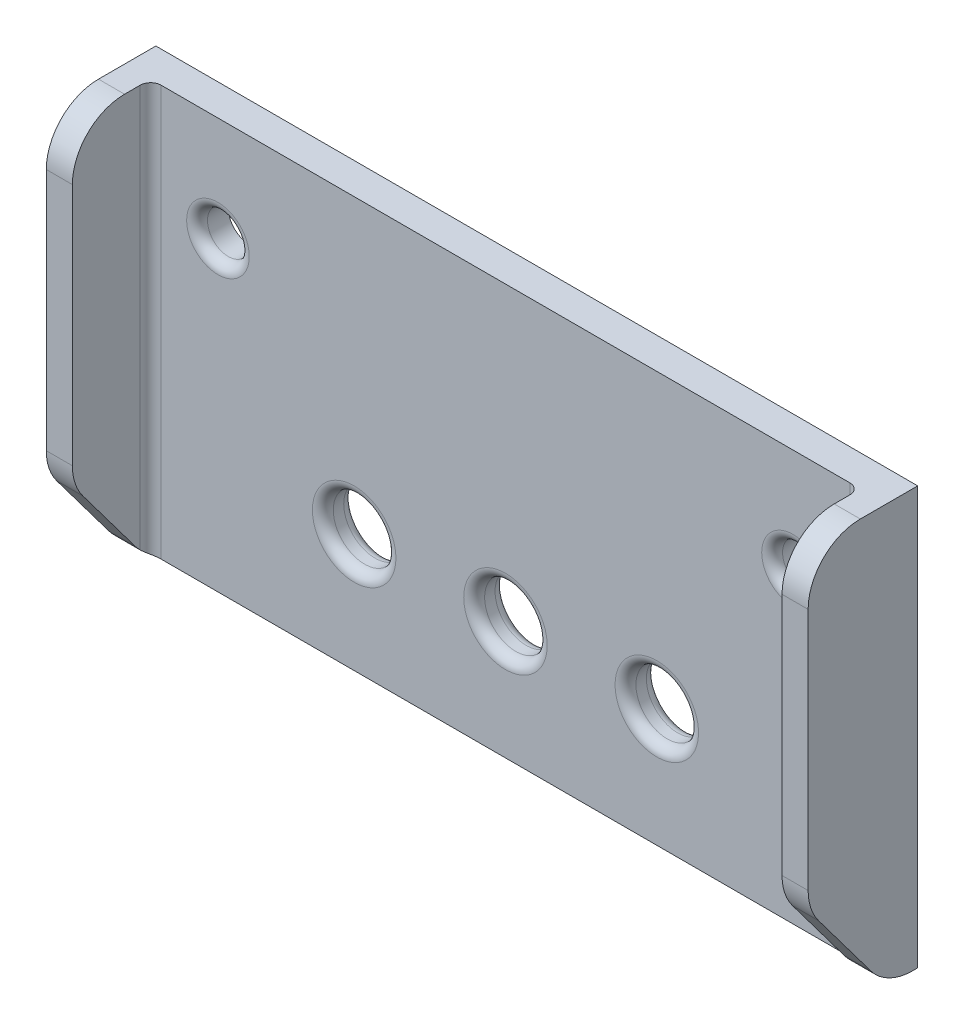
ISO-10303-21;
HEADER;
FILE_DESCRIPTION(('STEP AP214'),'2;1');
FILE_NAME('part.step','',(''),(''),'','','');
FILE_SCHEMA(('AUTOMOTIVE_DESIGN { 1 0 10303 214 1 1 1 1 }'));
ENDSEC;
DATA;
#1=APPLICATION_CONTEXT('core data for automotive mechanical design processes');
#2=APPLICATION_PROTOCOL_DEFINITION('international standard','automotive_design',2000,#1);
#3=PRODUCT_CONTEXT('',#1,'mechanical');
#4=PRODUCT('Part','Part','',(#3));
#5=PRODUCT_RELATED_PRODUCT_CATEGORY('part','',(#4));
#6=PRODUCT_DEFINITION_FORMATION('','',#4);
#7=PRODUCT_DEFINITION_CONTEXT('part definition',#1,'design');
#8=PRODUCT_DEFINITION('design','',#6,#7);
#9=PRODUCT_DEFINITION_SHAPE('','',#8);
#10=(LENGTH_UNIT() NAMED_UNIT(*) SI_UNIT(.MILLI.,.METRE.));
#11=(NAMED_UNIT(*) PLANE_ANGLE_UNIT() SI_UNIT($,.RADIAN.));
#12=(NAMED_UNIT(*) SI_UNIT($,.STERADIAN.) SOLID_ANGLE_UNIT());
#13=UNCERTAINTY_MEASURE_WITH_UNIT(LENGTH_MEASURE(1.E-05),#10,'distance_accuracy_value','');
#14=(GEOMETRIC_REPRESENTATION_CONTEXT(3) GLOBAL_UNCERTAINTY_ASSIGNED_CONTEXT((#13)) GLOBAL_UNIT_ASSIGNED_CONTEXT((#10,
#11,#12)) REPRESENTATION_CONTEXT('',''));
#15=CARTESIAN_POINT('',(0.,0.,0.));
#16=DIRECTION('',(0.,0.,1.));
#17=DIRECTION('',(1.,0.,0.));
#18=AXIS2_PLACEMENT_3D('',#15,#16,#17);
#19=CARTESIAN_POINT('',(79.9999999999999,-24.,0.499999999999987));
#20=DIRECTION('',(-1.,0.,0.));
#21=DIRECTION('',(0.,0.,1.));
#22=AXIS2_PLACEMENT_3D('',#19,#20,#21);
#23=CYLINDRICAL_SURFACE('',#22,5.);
#24=DIRECTION('',(1.,0.,0.));
#25=VECTOR('',#24,1.);
#26=CARTESIAN_POINT('',(79.9999999999999,-27.,4.49999999999999));
#27=LINE('',#26,#25);
#28=CARTESIAN_POINT('',(23.9999999999999,-27.,4.49999999999999));
#29=VERTEX_POINT('',#28);
#30=CARTESIAN_POINT('',(26.4999999999999,-27.,4.49999999999999));
#31=VERTEX_POINT('',#30);
#32=EDGE_CURVE('E180',#29,#31,#27,.T.);
#33=ORIENTED_EDGE('',*,*,#32,.F.);
#34=CARTESIAN_POINT('',(23.9999999999999,-24.,0.499999999999994));
#35=DIRECTION('',(1.,0.,0.));
#36=DIRECTION('',(0.,1.,0.));
#37=AXIS2_PLACEMENT_3D('',#34,#35,#36);
#38=CIRCLE('',#37,5.);
#39=CARTESIAN_POINT('',(23.9999999999999,-27.5707142142714,4.));
#40=VERTEX_POINT('',#39);
#41=EDGE_CURVE('E239',#40,#29,#38,.F.);
#42=ORIENTED_EDGE('',*,*,#41,.F.);
#43=CARTESIAN_POINT('',(23.9999999999999,-27.5707142142714,4.));
#44=CARTESIAN_POINT('',(23.9999930676676,-27.6002186072207,3.9699006570499));
#45=CARTESIAN_POINT('',(23.9986395311535,-27.6293320134944,3.93943493010971));
#46=CARTESIAN_POINT('',(23.9929994413152,-27.6866936609947,3.87787893576926));
#47=CARTESIAN_POINT('',(23.9887082699565,-27.7149404667493,3.84678775995062));
#48=CARTESIAN_POINT('',(23.971001342381,-27.7984571182347,3.75250029079684));
#49=CARTESIAN_POINT('',(23.9527461770954,-27.8521381486544,3.68866295917825));
#50=CARTESIAN_POINT('',(23.9073130950106,-27.9421972995765,3.57621109710281));
#51=CARTESIAN_POINT('',(23.883031082257,-27.979765118423,3.52737514429793));
#52=CARTESIAN_POINT('',(23.8250499209178,-28.0503857885509,3.43221179524257));
#53=CARTESIAN_POINT('',(23.7913751461828,-28.0834500003449,3.38587827185391));
#54=CARTESIAN_POINT('',(23.7140395694052,-28.1445644660207,3.29741112008585));
#55=CARTESIAN_POINT('',(23.6702843804115,-28.17256255451,3.25532296804957));
#56=CARTESIAN_POINT('',(23.5735716970965,-28.2222728300454,3.17852823174094));
#57=CARTESIAN_POINT('',(23.5206165144656,-28.2439865925143,3.14381979802089));
#58=CARTESIAN_POINT('',(23.4155387941315,-28.2777449090995,3.08878145465239));
#59=CARTESIAN_POINT('',(23.3644310835303,-28.2907400373399,3.06708993429551));
#60=CARTESIAN_POINT('',(23.2583768128417,-28.3113331748112,3.03235478286105));
#61=CARTESIAN_POINT('',(23.2034382432818,-28.3189420695415,3.01929371334593));
#62=CARTESIAN_POINT('',(23.1232414566439,-28.3258974870813,3.00731429327415));
#63=CARTESIAN_POINT('',(23.0986826545608,-28.3274839828488,3.00457346971455));
#64=CARTESIAN_POINT('',(23.0494208900586,-28.3295973862361,3.00091773228209));
#65=CARTESIAN_POINT('',(23.0247181949247,-28.3301258592244,3.00000012094068));
#66=CARTESIAN_POINT('',(22.9999999999999,-28.3301270189222,3.));
#67=B_SPLINE_CURVE_WITH_KNOTS('',3,(#43,#44,#45,#46,#47,#48,#49,#50,#51,#52,#53,#54,#55,#56,#57,
#58,#59,#60,#61,#62,#63,#64,#65,#66),.UNSPECIFIED.,.F.,.F.,(4,2,2,2,2,2,2,2,2,2,2,4),(0.,
0.126387089943436,0.252973321143465,0.507695609755686,0.705639917777366,0.903075271793413,
1.10244036970792,1.30175544524449,1.47186716731677,1.64163410690023,1.7158453186886,
1.78994665192581),.UNSPECIFIED.);
#68=CARTESIAN_POINT('',(22.9999999999999,-28.3301270189222,3.00000000000001));
#69=VERTEX_POINT('',#68);
#70=EDGE_CURVE('E310',#40,#69,#67,.T.);
#71=ORIENTED_EDGE('',*,*,#70,.T.);
#72=DIRECTION('',(-1.,0.,0.));
#73=VECTOR('',#72,1.);
#74=CARTESIAN_POINT('',(79.9999999999999,-28.3301270189222,3.));
#75=LINE('',#74,#73);
#76=CARTESIAN_POINT('',(-43.0000000000001,-28.3301270189222,3.00000000000002));
#77=VERTEX_POINT('',#76);
#78=EDGE_CURVE('E235',#77,#69,#75,.F.);
#79=ORIENTED_EDGE('',*,*,#78,.F.);
#80=CARTESIAN_POINT('',(-43.0000000000001,-28.3301270189222,3.));
#81=CARTESIAN_POINT('',(-43.0250917043528,-28.3301264619005,2.99999863256401));
#82=CARTESIAN_POINT('',(-43.0501706936837,-28.3295814792149,3.0009451434556));
#83=CARTESIAN_POINT('',(-43.1001347422109,-28.3274046434899,3.00471078494186));
#84=CARTESIAN_POINT('',(-43.1250198428232,-28.325773029381,3.00752950387154));
#85=CARTESIAN_POINT('',(-43.1989388654176,-28.3192692738345,3.01872819076792));
#86=CARTESIAN_POINT('',(-43.2474518438432,-28.3127881439752,3.02985113206557));
#87=CARTESIAN_POINT('',(-43.3415742856007,-28.2956426343319,3.05885396236154));
#88=CARTESIAN_POINT('',(-43.3871846974332,-28.2849796293442,3.07673163066474));
#89=CARTESIAN_POINT('',(-43.4744441900434,-28.2596525601428,3.11838730385573));
#90=CARTESIAN_POINT('',(-43.5160910644644,-28.2449862848217,3.14216856879013));
#91=CARTESIAN_POINT('',(-43.5959155786588,-28.2113492295649,3.19547047522606));
#92=CARTESIAN_POINT('',(-43.633923704345,-28.192247268289,3.22516098444924));
#93=CARTESIAN_POINT('',(-43.7042168298947,-28.1504259428718,3.28844071428515));
#94=CARTESIAN_POINT('',(-43.7365028778026,-28.1277072426152,3.32202921907991));
#95=CARTESIAN_POINT('',(-43.7985121611949,-28.0762876833706,3.3958803553395));
#96=CARTESIAN_POINT('',(-43.8275251346771,-28.0472002313887,3.43646746790958));
#97=CARTESIAN_POINT('',(-43.8784102176725,-27.9855577173115,3.51960504306239));
#98=CARTESIAN_POINT('',(-43.9002628219138,-27.9529934986219,3.56216051402092));
#99=CARTESIAN_POINT('',(-43.932986664365,-27.892690996402,3.63827355021968));
#100=CARTESIAN_POINT('',(-43.9452221375383,-27.8655130198292,3.67170377403303));
#101=CARTESIAN_POINT('',(-43.9658545944003,-27.809673280999,3.73856262045828));
#102=CARTESIAN_POINT('',(-43.9742478770305,-27.7810101175632,3.77199121064137));
#103=CARTESIAN_POINT('',(-43.9874103338676,-27.7226196562202,3.83826901931417));
#104=CARTESIAN_POINT('',(-43.992199926385,-27.6928993683897,3.8711204560123));
#105=CARTESIAN_POINT('',(-43.9984899148028,-27.632494632088,3.93612588078439));
#106=CARTESIAN_POINT('',(-43.9999970022617,-27.6018122746964,3.96828115520262));
#107=CARTESIAN_POINT('',(-44.0000000000001,-27.5707142142714,4.));
#108=B_SPLINE_CURVE_WITH_KNOTS('',3,(#80,#81,#82,#83,#84,#85,#86,#87,#88,#89,#90,#91,#92,#93,
#94,#95,#96,#97,#98,#99,#100,#101,#102,#103,#104,#105,#106,#107),.UNSPECIFIED.,.F.,.F.,(4,2,2,2,
2,2,2,2,2,2,2,2,2,4),(0.,0.0752264083476392,0.150436281229343,0.300218677401701,
0.449951873655379,0.599767939272063,0.754758687632558,0.909721018790721,1.08232580800139,
1.25539694790243,1.38956975374294,1.52387153336175,1.65740651426769,1.79066902133077),.UNSPECIFIED.);
#109=CARTESIAN_POINT('',(-44.0000000000001,-27.5707142142714,4.));
#110=VERTEX_POINT('',#109);
#111=EDGE_CURVE('E61',#77,#110,#108,.T.);
#112=ORIENTED_EDGE('',*,*,#111,.T.);
#113=CARTESIAN_POINT('',(-44.0000000000001,-24.,0.500000000000003));
#114=DIRECTION('',(-1.,0.,0.));
#115=DIRECTION('',(0.,-1.,0.));
#116=AXIS2_PLACEMENT_3D('',#113,#114,#115);
#117=CIRCLE('',#116,5.);
#118=CARTESIAN_POINT('',(-44.0000000000001,-27.,4.5));
#119=VERTEX_POINT('',#118);
#120=EDGE_CURVE('E232',#119,#110,#117,.F.);
#121=ORIENTED_EDGE('',*,*,#120,.F.);
#122=DIRECTION('',(-1.,0.,0.));
#123=VECTOR('',#122,1.);
#124=CARTESIAN_POINT('',(79.9999999999999,-27.,4.49999999999999));
#125=LINE('',#124,#123);
#126=CARTESIAN_POINT('',(-46.5000000000001,-27.,4.5));
#127=VERTEX_POINT('',#126);
#128=EDGE_CURVE('E228',#127,#119,#125,.F.);
#129=ORIENTED_EDGE('',*,*,#128,.F.);
#130=CARTESIAN_POINT('',(-46.5000000000001,-24.,0.500000000000003));
#131=DIRECTION('',(1.,0.,0.));
#132=DIRECTION('',(0.,1.,0.));
#133=AXIS2_PLACEMENT_3D('',#130,#131,#132);
#134=CIRCLE('',#133,5.);
#135=CARTESIAN_POINT('',(-46.5000000000001,-29.,0.500000000000003));
#136=VERTEX_POINT('',#135);
#137=EDGE_CURVE('E225',#136,#127,#134,.F.);
#138=ORIENTED_EDGE('',*,*,#137,.F.);
#139=DIRECTION('',(1.,0.,0.));
#140=VECTOR('',#139,1.);
#141=CARTESIAN_POINT('',(79.9999999999999,-29.,0.499999999999987));
#142=LINE('',#141,#140);
#143=CARTESIAN_POINT('',(26.4999999999999,-29.,0.499999999999994));
#144=VERTEX_POINT('',#143);
#145=EDGE_CURVE('E175',#144,#136,#142,.F.);
#146=ORIENTED_EDGE('',*,*,#145,.F.);
#147=CARTESIAN_POINT('',(26.4999999999999,-24.,0.499999999999994));
#148=DIRECTION('',(-1.,0.,0.));
#149=DIRECTION('',(0.,-1.,0.));
#150=AXIS2_PLACEMENT_3D('',#147,#148,#149);
#151=CIRCLE('',#150,5.);
#152=EDGE_CURVE('E242',#31,#144,#151,.F.);
#153=ORIENTED_EDGE('',*,*,#152,.F.);
#154=EDGE_LOOP('',(#33,#42,#71,#79,#112,#121,#129,#138,#146,#153));
#155=FACE_BOUND('',#154,.T.);
#156=ADVANCED_FACE('F45',(#155),#23,.T.);
#157=CARTESIAN_POINT('',(-46.5000000000001,11.,3.));
#158=DIRECTION('',(1.,0.,0.));
#159=DIRECTION('',(0.,1.,0.));
#160=AXIS2_PLACEMENT_3D('',#157,#158,#159);
#161=PLANE('',#160);
#162=DIRECTION('',(0.,-1.,0.));
#163=VECTOR('',#162,1.);
#164=CARTESIAN_POINT('',(-46.5000000000001,11.,10.5));
#165=LINE('',#164,#163);
#166=CARTESIAN_POINT('',(-46.5000000000001,5.99999999999999,10.5));
#167=VERTEX_POINT('',#166);
#168=CARTESIAN_POINT('',(-46.5000000000001,-17.3333333333333,10.5));
#169=VERTEX_POINT('',#168);
#170=EDGE_CURVE('E649',#167,#169,#165,.T.);
#171=ORIENTED_EDGE('',*,*,#170,.F.);
#172=CARTESIAN_POINT('',(-46.5000000000001,5.99999999999999,5.5));
#173=DIRECTION('',(1.,0.,0.));
#174=DIRECTION('',(0.,1.,0.));
#175=AXIS2_PLACEMENT_3D('',#172,#173,#174);
#176=CIRCLE('',#175,5.);
#177=CARTESIAN_POINT('',(-46.5000000000001,11.,5.5));
#178=VERTEX_POINT('',#177);
#179=EDGE_CURVE('E256',#167,#178,#176,.F.);
#180=ORIENTED_EDGE('',*,*,#179,.T.);
#181=DIRECTION('',(0.,0.,-1.));
#182=VECTOR('',#181,1.);
#183=CARTESIAN_POINT('',(-46.5000000000001,11.,3.));
#184=LINE('',#183,#182);
#185=CARTESIAN_POINT('',(-46.5000000000001,11.,0.));
#186=VERTEX_POINT('',#185);
#187=EDGE_CURVE('E195',#178,#186,#184,.T.);
#188=ORIENTED_EDGE('',*,*,#187,.T.);
#189=DIRECTION('',(0.,-1.,0.));
#190=VECTOR('',#189,1.);
#191=CARTESIAN_POINT('',(-46.5000000000001,11.,0.));
#192=LINE('',#191,#190);
#193=CARTESIAN_POINT('',(-46.5000000000001,-29.,0.));
#194=VERTEX_POINT('',#193);
#195=EDGE_CURVE('E187',#186,#194,#192,.T.);
#196=ORIENTED_EDGE('',*,*,#195,.T.);
#197=DIRECTION('',(0.,0.,-1.));
#198=VECTOR('',#197,1.);
#199=CARTESIAN_POINT('',(-46.5000000000001,-29.,3.));
#200=LINE('',#199,#198);
#201=EDGE_CURVE('E168',#136,#194,#200,.T.);
#202=ORIENTED_EDGE('',*,*,#201,.F.);
#203=ORIENTED_EDGE('',*,*,#137,.T.);
#204=DIRECTION('',(0.,-0.8,-0.6));
#205=VECTOR('',#204,1.);
#206=CARTESIAN_POINT('',(-46.5000000000001,-3.40000000000001,22.2));
#207=LINE('',#206,#205);
#208=CARTESIAN_POINT('',(-46.5000000000001,-20.3333333333333,9.5));
#209=VERTEX_POINT('',#208);
#210=EDGE_CURVE('E635',#209,#127,#207,.T.);
#211=ORIENTED_EDGE('',*,*,#210,.F.);
#212=CARTESIAN_POINT('',(-46.5000000000001,-17.3333333333333,5.5));
#213=DIRECTION('',(1.,0.,0.));
#214=DIRECTION('',(0.,1.,0.));
#215=AXIS2_PLACEMENT_3D('',#212,#213,#214);
#216=CIRCLE('',#215,5.);
#217=EDGE_CURVE('E253',#209,#169,#216,.F.);
#218=ORIENTED_EDGE('',*,*,#217,.T.);
#219=EDGE_LOOP('',(#171,#180,#188,#196,#202,#203,#211,#218));
#220=FACE_BOUND('',#219,.T.);
#221=ADVANCED_FACE('F193',(#220),#161,.F.);
#222=CARTESIAN_POINT('',(26.4999999999999,-29.,3.));
#223=DIRECTION('',(0.,1.,0.));
#224=DIRECTION('',(0.,0.,1.));
#225=AXIS2_PLACEMENT_3D('',#222,#223,#224);
#226=PLANE('',#225);
#227=DIRECTION('',(0.,0.,-1.));
#228=VECTOR('',#227,1.);
#229=CARTESIAN_POINT('',(26.4999999999999,-29.,3.));
#230=LINE('',#229,#228);
#231=CARTESIAN_POINT('',(26.4999999999999,-29.,0.));
#232=VERTEX_POINT('',#231);
#233=EDGE_CURVE('E181',#144,#232,#230,.T.);
#234=ORIENTED_EDGE('',*,*,#233,.F.);
#235=ORIENTED_EDGE('',*,*,#145,.T.);
#236=ORIENTED_EDGE('',*,*,#201,.T.);
#237=DIRECTION('',(1.,0.,0.));
#238=VECTOR('',#237,1.);
#239=CARTESIAN_POINT('',(26.4999999999999,-29.,0.));
#240=LINE('',#239,#238);
#241=EDGE_CURVE('E172',#194,#232,#240,.T.);
#242=ORIENTED_EDGE('',*,*,#241,.T.);
#243=EDGE_LOOP('',(#234,#235,#236,#242));
#244=FACE_BOUND('',#243,.T.);
#245=ADVANCED_FACE('F171',(#244),#226,.F.);
#246=CARTESIAN_POINT('',(26.4999999999999,11.,3.));
#247=DIRECTION('',(-1.,0.,0.));
#248=DIRECTION('',(0.,-1.,0.));
#249=AXIS2_PLACEMENT_3D('',#246,#247,#248);
#250=PLANE('',#249);
#251=DIRECTION('',(0.,0.,-1.));
#252=VECTOR('',#251,1.);
#253=CARTESIAN_POINT('',(26.4999999999999,11.,3.));
#254=LINE('',#253,#252);
#255=CARTESIAN_POINT('',(26.4999999999999,11.,5.5));
#256=VERTEX_POINT('',#255);
#257=CARTESIAN_POINT('',(26.4999999999999,11.,0.));
#258=VERTEX_POINT('',#257);
#259=EDGE_CURVE('E215',#256,#258,#254,.T.);
#260=ORIENTED_EDGE('',*,*,#259,.F.);
#261=CARTESIAN_POINT('',(26.4999999999999,5.99999999999999,5.5));
#262=DIRECTION('',(-1.,0.,0.));
#263=DIRECTION('',(0.,-1.,0.));
#264=AXIS2_PLACEMENT_3D('',#261,#262,#263);
#265=CIRCLE('',#264,5.);
#266=CARTESIAN_POINT('',(26.4999999999999,5.99999999999999,10.5));
#267=VERTEX_POINT('',#266);
#268=EDGE_CURVE('E287',#256,#267,#265,.F.);
#269=ORIENTED_EDGE('',*,*,#268,.T.);
#270=DIRECTION('',(0.,1.,0.));
#271=VECTOR('',#270,1.);
#272=CARTESIAN_POINT('',(26.4999999999999,-29.,10.5));
#273=LINE('',#272,#271);
#274=CARTESIAN_POINT('',(26.4999999999999,-17.3333333333333,10.5));
#275=VERTEX_POINT('',#274);
#276=EDGE_CURVE('E653',#275,#267,#273,.T.);
#277=ORIENTED_EDGE('',*,*,#276,.F.);
#278=CARTESIAN_POINT('',(26.4999999999999,-17.3333333333333,5.5));
#279=DIRECTION('',(-1.,0.,0.));
#280=DIRECTION('',(0.,-1.,0.));
#281=AXIS2_PLACEMENT_3D('',#278,#279,#280);
#282=CIRCLE('',#281,5.);
#283=CARTESIAN_POINT('',(26.4999999999999,-20.3333333333333,9.5));
#284=VERTEX_POINT('',#283);
#285=EDGE_CURVE('E284',#275,#284,#282,.F.);
#286=ORIENTED_EDGE('',*,*,#285,.T.);
#287=DIRECTION('',(0.,0.8,0.6));
#288=VECTOR('',#287,1.);
#289=CARTESIAN_POINT('',(26.4999999999999,-3.4,22.2));
#290=LINE('',#289,#288);
#291=EDGE_CURVE('E639',#31,#284,#290,.T.);
#292=ORIENTED_EDGE('',*,*,#291,.F.);
#293=ORIENTED_EDGE('',*,*,#152,.T.);
#294=ORIENTED_EDGE('',*,*,#233,.T.);
#295=DIRECTION('',(0.,1.,0.));
#296=VECTOR('',#295,1.);
#297=CARTESIAN_POINT('',(26.4999999999999,11.,0.));
#298=LINE('',#297,#296);
#299=EDGE_CURVE('E189',#232,#258,#298,.T.);
#300=ORIENTED_EDGE('',*,*,#299,.T.);
#301=EDGE_LOOP('',(#260,#269,#277,#286,#292,#293,#294,#300));
#302=FACE_BOUND('',#301,.T.);
#303=ADVANCED_FACE('F477',(#302),#250,.F.);
#304=CARTESIAN_POINT('',(23.9999999999999,-29.,10.5));
#305=DIRECTION('',(1.,0.,0.));
#306=DIRECTION('',(0.,1.,0.));
#307=AXIS2_PLACEMENT_3D('',#304,#305,#306);
#308=PLANE('',#307);
#309=DIRECTION('',(0.,0.,-1.));
#310=VECTOR('',#309,1.);
#311=CARTESIAN_POINT('',(23.9999999999999,11.,10.5));
#312=LINE('',#311,#310);
#313=CARTESIAN_POINT('',(23.9999999999999,11.,5.5));
#314=VERTEX_POINT('',#313);
#315=CARTESIAN_POINT('',(23.9999999999999,11.,4.));
#316=VERTEX_POINT('',#315);
#317=EDGE_CURVE('E638',#314,#316,#312,.T.);
#318=ORIENTED_EDGE('',*,*,#317,.T.);
#319=DIRECTION('',(0.,-1.,0.));
#320=VECTOR('',#319,1.);
#321=CARTESIAN_POINT('',(23.9999999999999,-28.3301270189222,4.));
#322=LINE('',#321,#320);
#323=EDGE_CURVE('E297',#316,#40,#322,.T.);
#324=ORIENTED_EDGE('',*,*,#323,.T.);
#325=ORIENTED_EDGE('',*,*,#41,.T.);
#326=DIRECTION('',(0.,-0.8,-0.6));
#327=VECTOR('',#326,1.);
#328=CARTESIAN_POINT('',(23.9999999999999,-25.4,5.69999999999999));
#329=LINE('',#328,#327);
#330=CARTESIAN_POINT('',(23.9999999999999,-20.3333333333333,9.5));
#331=VERTEX_POINT('',#330);
#332=EDGE_CURVE('E449',#331,#29,#329,.T.);
#333=ORIENTED_EDGE('',*,*,#332,.F.);
#334=CARTESIAN_POINT('',(23.9999999999999,-17.3333333333333,5.5));
#335=DIRECTION('',(1.,0.,0.));
#336=DIRECTION('',(0.,1.,0.));
#337=AXIS2_PLACEMENT_3D('',#334,#335,#336);
#338=CIRCLE('',#337,5.);
#339=CARTESIAN_POINT('',(23.9999999999999,-17.3333333333333,10.5));
#340=VERTEX_POINT('',#339);
#341=EDGE_CURVE('E278',#331,#340,#338,.F.);
#342=ORIENTED_EDGE('',*,*,#341,.T.);
#343=DIRECTION('',(0.,-1.,0.));
#344=VECTOR('',#343,1.);
#345=CARTESIAN_POINT('',(23.9999999999999,-29.,10.5));
#346=LINE('',#345,#344);
#347=CARTESIAN_POINT('',(23.9999999999999,5.99999999999999,10.5));
#348=VERTEX_POINT('',#347);
#349=EDGE_CURVE('E643',#348,#340,#346,.T.);
#350=ORIENTED_EDGE('',*,*,#349,.F.);
#351=CARTESIAN_POINT('',(23.9999999999999,5.99999999999999,5.5));
#352=DIRECTION('',(1.,0.,0.));
#353=DIRECTION('',(0.,1.,0.));
#354=AXIS2_PLACEMENT_3D('',#351,#352,#353);
#355=CIRCLE('',#354,5.);
#356=EDGE_CURVE('E281',#348,#314,#355,.F.);
#357=ORIENTED_EDGE('',*,*,#356,.T.);
#358=EDGE_LOOP('',(#318,#324,#325,#333,#342,#350,#357));
#359=FACE_BOUND('',#358,.T.);
#360=ADVANCED_FACE('F479',(#359),#308,.F.);
#361=CARTESIAN_POINT('',(0.,0.,10.5));
#362=DIRECTION('',(0.,0.,1.));
#363=DIRECTION('',(1.,0.,0.));
#364=AXIS2_PLACEMENT_3D('',#361,#362,#363);
#365=PLANE('',#364);
#366=ORIENTED_EDGE('',*,*,#276,.T.);
#367=DIRECTION('',(-1.,0.,0.));
#368=VECTOR('',#367,1.);
#369=CARTESIAN_POINT('',(23.9999999999999,5.99999999999999,10.5));
#370=LINE('',#369,#368);
#371=EDGE_CURVE('E274',#267,#348,#370,.T.);
#372=ORIENTED_EDGE('',*,*,#371,.T.);
#373=ORIENTED_EDGE('',*,*,#349,.T.);
#374=DIRECTION('',(-1.,0.,0.));
#375=VECTOR('',#374,1.);
#376=CARTESIAN_POINT('',(0.,-17.3333333333333,10.5));
#377=LINE('',#376,#375);
#378=EDGE_CURVE('E271',#340,#275,#377,.F.);
#379=ORIENTED_EDGE('',*,*,#378,.T.);
#380=EDGE_LOOP('',(#366,#372,#373,#379));
#381=FACE_BOUND('',#380,.T.);
#382=ADVANCED_FACE('F497',(#381),#365,.T.);
#383=CARTESIAN_POINT('',(-44.0000000000001,11.,10.5));
#384=DIRECTION('',(-1.,0.,0.));
#385=DIRECTION('',(0.,-1.,0.));
#386=AXIS2_PLACEMENT_3D('',#383,#384,#385);
#387=PLANE('',#386);
#388=ORIENTED_EDGE('',*,*,#120,.T.);
#389=DIRECTION('',(0.,1.,0.));
#390=VECTOR('',#389,1.);
#391=CARTESIAN_POINT('',(-44.0000000000001,11.,4.));
#392=LINE('',#391,#390);
#393=CARTESIAN_POINT('',(-44.0000000000001,11.,4.));
#394=VERTEX_POINT('',#393);
#395=EDGE_CURVE('E307',#110,#394,#392,.T.);
#396=ORIENTED_EDGE('',*,*,#395,.T.);
#397=DIRECTION('',(0.,0.,-1.));
#398=VECTOR('',#397,1.);
#399=CARTESIAN_POINT('',(-44.0000000000001,11.,10.5));
#400=LINE('',#399,#398);
#401=CARTESIAN_POINT('',(-44.0000000000001,11.,5.5));
#402=VERTEX_POINT('',#401);
#403=EDGE_CURVE('E198',#402,#394,#400,.T.);
#404=ORIENTED_EDGE('',*,*,#403,.F.);
#405=CARTESIAN_POINT('',(-44.0000000000001,5.99999999999999,5.5));
#406=DIRECTION('',(-1.,0.,0.));
#407=DIRECTION('',(0.,-1.,0.));
#408=AXIS2_PLACEMENT_3D('',#405,#406,#407);
#409=CIRCLE('',#408,5.);
#410=CARTESIAN_POINT('',(-44.0000000000001,5.99999999999999,10.5));
#411=VERTEX_POINT('',#410);
#412=EDGE_CURVE('E268',#402,#411,#409,.F.);
#413=ORIENTED_EDGE('',*,*,#412,.T.);
#414=DIRECTION('',(0.,1.,0.));
#415=VECTOR('',#414,1.);
#416=CARTESIAN_POINT('',(-44.0000000000001,11.,10.5));
#417=LINE('',#416,#415);
#418=CARTESIAN_POINT('',(-44.0000000000001,-17.3333333333333,10.5));
#419=VERTEX_POINT('',#418);
#420=EDGE_CURVE('E202',#419,#411,#417,.T.);
#421=ORIENTED_EDGE('',*,*,#420,.F.);
#422=CARTESIAN_POINT('',(-44.0000000000001,-17.3333333333333,5.5));
#423=DIRECTION('',(-1.,0.,0.));
#424=DIRECTION('',(0.,-1.,0.));
#425=AXIS2_PLACEMENT_3D('',#422,#423,#424);
#426=CIRCLE('',#425,5.);
#427=CARTESIAN_POINT('',(-44.0000000000001,-20.3333333333333,9.5));
#428=VERTEX_POINT('',#427);
#429=EDGE_CURVE('E265',#419,#428,#426,.F.);
#430=ORIENTED_EDGE('',*,*,#429,.T.);
#431=DIRECTION('',(0.,0.8,0.6));
#432=VECTOR('',#431,1.);
#433=CARTESIAN_POINT('',(-44.0000000000001,0.199999999999992,24.9));
#434=LINE('',#433,#432);
#435=EDGE_CURVE('E443',#119,#428,#434,.T.);
#436=ORIENTED_EDGE('',*,*,#435,.F.);
#437=EDGE_LOOP('',(#388,#396,#404,#413,#421,#430,#436));
#438=FACE_BOUND('',#437,.T.);
#439=ADVANCED_FACE('F501',(#438),#387,.F.);
#440=CARTESIAN_POINT('',(0.,0.,10.5));
#441=DIRECTION('',(0.,0.,1.));
#442=DIRECTION('',(1.,0.,0.));
#443=AXIS2_PLACEMENT_3D('',#440,#441,#442);
#444=PLANE('',#443);
#445=ORIENTED_EDGE('',*,*,#420,.T.);
#446=DIRECTION('',(-1.,0.,0.));
#447=VECTOR('',#446,1.);
#448=CARTESIAN_POINT('',(-46.5000000000001,5.99999999999999,10.5));
#449=LINE('',#448,#447);
#450=EDGE_CURVE('E249',#411,#167,#449,.T.);
#451=ORIENTED_EDGE('',*,*,#450,.T.);
#452=ORIENTED_EDGE('',*,*,#170,.T.);
#453=DIRECTION('',(1.,0.,0.));
#454=VECTOR('',#453,1.);
#455=CARTESIAN_POINT('',(0.,-17.3333333333333,10.5));
#456=LINE('',#455,#454);
#457=EDGE_CURVE('E245',#169,#419,#456,.T.);
#458=ORIENTED_EDGE('',*,*,#457,.T.);
#459=EDGE_LOOP('',(#445,#451,#452,#458));
#460=FACE_BOUND('',#459,.T.);
#461=ADVANCED_FACE('F506',(#460),#444,.T.);
#462=CARTESIAN_POINT('',(0.,0.,3.));
#463=DIRECTION('',(0.,0.,-1.));
#464=DIRECTION('',(-1.,0.,0.));
#465=AXIS2_PLACEMENT_3D('',#462,#463,#464);
#466=PLANE('',#465);
#467=CARTESIAN_POINT('',(4.49999999999192,-17.0000000000055,3.));
#468=DIRECTION('',(0.,0.,-1.));
#469=DIRECTION('',(-1.,0.,0.));
#470=AXIS2_PLACEMENT_3D('',#467,#468,#469);
#471=CIRCLE('',#470,4.);
#472=CARTESIAN_POINT('',(0.49999999999192,-17.0000000000055,3.));
#473=VERTEX_POINT('',#472);
#474=EDGE_CURVE('E416',#473,#473,#471,.T.);
#475=ORIENTED_EDGE('',*,*,#474,.T.);
#476=EDGE_LOOP('',(#475));
#477=FACE_BOUND('',#476,.T.);
#478=CARTESIAN_POINT('',(-10.0000000000023,-17.0000000000014,3.));
#479=DIRECTION('',(0.,0.,-1.));
#480=DIRECTION('',(-1.,0.,0.));
#481=AXIS2_PLACEMENT_3D('',#478,#479,#480);
#482=CIRCLE('',#481,4.);
#483=CARTESIAN_POINT('',(-14.0000000000023,-17.0000000000014,3.));
#484=VERTEX_POINT('',#483);
#485=EDGE_CURVE('E420',#484,#484,#482,.T.);
#486=ORIENTED_EDGE('',*,*,#485,.T.);
#487=EDGE_LOOP('',(#486));
#488=FACE_BOUND('',#487,.T.);
#489=CARTESIAN_POINT('',(-24.5000000000023,-17.0000000000014,3.));
#490=DIRECTION('',(0.,0.,-1.));
#491=DIRECTION('',(-1.,0.,0.));
#492=AXIS2_PLACEMENT_3D('',#489,#490,#491);
#493=CIRCLE('',#492,4.);
#494=CARTESIAN_POINT('',(-28.5000000000023,-17.0000000000014,3.));
#495=VERTEX_POINT('',#494);
#496=EDGE_CURVE('E424',#495,#495,#493,.T.);
#497=ORIENTED_EDGE('',*,*,#496,.T.);
#498=EDGE_LOOP('',(#497));
#499=FACE_BOUND('',#498,.T.);
#500=CARTESIAN_POINT('',(17.5509246266625,0.999999999999449,3.));
#501=DIRECTION('',(0.,0.,-1.));
#502=DIRECTION('',(-1.,0.,0.));
#503=AXIS2_PLACEMENT_3D('',#500,#501,#502);
#504=CIRCLE('',#503,3.);
#505=CARTESIAN_POINT('',(14.5509246266625,0.999999999999449,3.));
#506=VERTEX_POINT('',#505);
#507=EDGE_CURVE('E382',#506,#506,#504,.T.);
#508=ORIENTED_EDGE('',*,*,#507,.T.);
#509=EDGE_LOOP('',(#508));
#510=FACE_BOUND('',#509,.T.);
#511=CARTESIAN_POINT('',(-37.5509246266628,0.999999999999439,3.));
#512=DIRECTION('',(0.,0.,-1.));
#513=DIRECTION('',(-1.,0.,0.));
#514=AXIS2_PLACEMENT_3D('',#511,#512,#513);
#515=CIRCLE('',#514,3.);
#516=CARTESIAN_POINT('',(-40.5509246266628,0.999999999999439,3.));
#517=VERTEX_POINT('',#516);
#518=EDGE_CURVE('E430',#517,#517,#515,.T.);
#519=ORIENTED_EDGE('',*,*,#518,.T.);
#520=EDGE_LOOP('',(#519));
#521=FACE_BOUND('',#520,.T.);
#522=ORIENTED_EDGE('',*,*,#78,.T.);
#523=DIRECTION('',(0.,-1.,0.));
#524=VECTOR('',#523,1.);
#525=CARTESIAN_POINT('',(22.9999999999999,11.,3.));
#526=LINE('',#525,#524);
#527=CARTESIAN_POINT('',(22.9999999999999,11.,3.));
#528=VERTEX_POINT('',#527);
#529=EDGE_CURVE('E304',#69,#528,#526,.F.);
#530=ORIENTED_EDGE('',*,*,#529,.T.);
#531=DIRECTION('',(-1.,0.,0.));
#532=VECTOR('',#531,1.);
#533=CARTESIAN_POINT('',(26.4999999999999,11.,3.));
#534=LINE('',#533,#532);
#535=CARTESIAN_POINT('',(-43.0000000000001,11.,3.));
#536=VERTEX_POINT('',#535);
#537=EDGE_CURVE('E205',#528,#536,#534,.T.);
#538=ORIENTED_EDGE('',*,*,#537,.T.);
#539=DIRECTION('',(0.,1.,0.));
#540=VECTOR('',#539,1.);
#541=CARTESIAN_POINT('',(-43.0000000000001,-28.3301270189222,3.));
#542=LINE('',#541,#540);
#543=EDGE_CURVE('E301',#536,#77,#542,.F.);
#544=ORIENTED_EDGE('',*,*,#543,.T.);
#545=EDGE_LOOP('',(#522,#530,#538,#544));
#546=FACE_BOUND('',#545,.T.);
#547=ADVANCED_FACE('F470',(#477,#488,#499,#510,#521,#546),#466,.F.);
#548=CARTESIAN_POINT('',(26.4999999999999,11.,3.));
#549=DIRECTION('',(0.,-1.,0.));
#550=DIRECTION('',(0.,0.,-1.));
#551=AXIS2_PLACEMENT_3D('',#548,#549,#550);
#552=PLANE('',#551);
#553=ORIENTED_EDGE('',*,*,#187,.F.);
#554=DIRECTION('',(-1.,0.,0.));
#555=VECTOR('',#554,1.);
#556=CARTESIAN_POINT('',(-44.0000000000001,11.,5.5));
#557=LINE('',#556,#555);
#558=EDGE_CURVE('E262',#178,#402,#557,.F.);
#559=ORIENTED_EDGE('',*,*,#558,.T.);
#560=ORIENTED_EDGE('',*,*,#403,.T.);
#561=CARTESIAN_POINT('',(-43.0000000000001,11.,4.));
#562=DIRECTION('',(0.,-1.,0.));
#563=DIRECTION('',(0.,0.,-1.));
#564=AXIS2_PLACEMENT_3D('',#561,#562,#563);
#565=CIRCLE('',#564,1.);
#566=EDGE_CURVE('E69',#394,#536,#565,.T.);
#567=ORIENTED_EDGE('',*,*,#566,.T.);
#568=ORIENTED_EDGE('',*,*,#537,.F.);
#569=CARTESIAN_POINT('',(22.9999999999999,11.,4.));
#570=DIRECTION('',(0.,-1.,0.));
#571=DIRECTION('',(0.,0.,-1.));
#572=AXIS2_PLACEMENT_3D('',#569,#570,#571);
#573=CIRCLE('',#572,1.);
#574=EDGE_CURVE('E319',#528,#316,#573,.T.);
#575=ORIENTED_EDGE('',*,*,#574,.T.);
#576=ORIENTED_EDGE('',*,*,#317,.F.);
#577=DIRECTION('',(-1.,0.,0.));
#578=VECTOR('',#577,1.);
#579=CARTESIAN_POINT('',(26.4999999999999,11.,5.5));
#580=LINE('',#579,#578);
#581=EDGE_CURVE('E259',#314,#256,#580,.F.);
#582=ORIENTED_EDGE('',*,*,#581,.T.);
#583=ORIENTED_EDGE('',*,*,#259,.T.);
#584=DIRECTION('',(-1.,0.,0.));
#585=VECTOR('',#584,1.);
#586=CARTESIAN_POINT('',(26.4999999999999,11.,0.));
#587=LINE('',#586,#585);
#588=EDGE_CURVE('E210',#258,#186,#587,.T.);
#589=ORIENTED_EDGE('',*,*,#588,.T.);
#590=EDGE_LOOP('',(#553,#559,#560,#567,#568,#575,#576,#582,#583,#589));
#591=FACE_BOUND('',#590,.T.);
#592=ADVANCED_FACE('F458',(#591),#552,.F.);
#593=CARTESIAN_POINT('',(0.,0.,0.));
#594=DIRECTION('',(0.,0.,-1.));
#595=DIRECTION('',(-1.,0.,0.));
#596=AXIS2_PLACEMENT_3D('',#593,#594,#595);
#597=PLANE('',#596);
#598=CARTESIAN_POINT('',(4.49999999999192,-17.0000000000055,0.));
#599=DIRECTION('',(0.,0.,-1.));
#600=DIRECTION('',(-1.,0.,0.));
#601=AXIS2_PLACEMENT_3D('',#598,#599,#600);
#602=CIRCLE('',#601,4.);
#603=CARTESIAN_POINT('',(0.49999999999192,-17.0000000000055,0.));
#604=VERTEX_POINT('',#603);
#605=EDGE_CURVE('E404',#604,#604,#602,.F.);
#606=ORIENTED_EDGE('',*,*,#605,.T.);
#607=EDGE_LOOP('',(#606));
#608=FACE_BOUND('',#607,.T.);
#609=CARTESIAN_POINT('',(-10.0000000000023,-17.0000000000014,0.));
#610=DIRECTION('',(0.,0.,-1.));
#611=DIRECTION('',(-1.,0.,0.));
#612=AXIS2_PLACEMENT_3D('',#609,#610,#611);
#613=CIRCLE('',#612,4.);
#614=CARTESIAN_POINT('',(-14.0000000000023,-17.0000000000014,0.));
#615=VERTEX_POINT('',#614);
#616=EDGE_CURVE('E408',#615,#615,#613,.F.);
#617=ORIENTED_EDGE('',*,*,#616,.T.);
#618=EDGE_LOOP('',(#617));
#619=FACE_BOUND('',#618,.T.);
#620=CARTESIAN_POINT('',(-24.5000000000023,-17.0000000000014,0.));
#621=DIRECTION('',(0.,0.,-1.));
#622=DIRECTION('',(-1.,0.,0.));
#623=AXIS2_PLACEMENT_3D('',#620,#621,#622);
#624=CIRCLE('',#623,4.);
#625=CARTESIAN_POINT('',(-28.5000000000023,-17.0000000000014,0.));
#626=VERTEX_POINT('',#625);
#627=EDGE_CURVE('E412',#626,#626,#624,.F.);
#628=ORIENTED_EDGE('',*,*,#627,.T.);
#629=EDGE_LOOP('',(#628));
#630=FACE_BOUND('',#629,.T.);
#631=CARTESIAN_POINT('',(-37.5509246266628,0.999999999999439,0.));
#632=DIRECTION('',(0.,0.,-1.));
#633=DIRECTION('',(-1.,0.,0.));
#634=AXIS2_PLACEMENT_3D('',#631,#632,#633);
#635=CIRCLE('',#634,2.);
#636=CARTESIAN_POINT('',(-39.5509246266628,0.999999999999439,0.));
#637=VERTEX_POINT('',#636);
#638=EDGE_CURVE('E440',#637,#637,#635,.T.);
#639=ORIENTED_EDGE('',*,*,#638,.F.);
#640=EDGE_LOOP('',(#639));
#641=FACE_BOUND('',#640,.T.);
#642=CARTESIAN_POINT('',(17.5509246266625,0.999999999999449,0.));
#643=DIRECTION('',(0.,0.,-1.));
#644=DIRECTION('',(-1.,0.,0.));
#645=AXIS2_PLACEMENT_3D('',#642,#643,#644);
#646=CIRCLE('',#645,2.);
#647=CARTESIAN_POINT('',(15.5509246266625,0.999999999999449,0.));
#648=VERTEX_POINT('',#647);
#649=EDGE_CURVE('E341',#648,#648,#646,.T.);
#650=ORIENTED_EDGE('',*,*,#649,.F.);
#651=EDGE_LOOP('',(#650));
#652=FACE_BOUND('',#651,.T.);
#653=ORIENTED_EDGE('',*,*,#195,.F.);
#654=ORIENTED_EDGE('',*,*,#588,.F.);
#655=ORIENTED_EDGE('',*,*,#299,.F.);
#656=ORIENTED_EDGE('',*,*,#241,.F.);
#657=EDGE_LOOP('',(#653,#654,#655,#656));
#658=FACE_BOUND('',#657,.T.);
#659=ADVANCED_FACE('F185',(#608,#619,#630,#641,#652,#658),#597,.T.);
#660=CARTESIAN_POINT('',(79.9999999999999,-19.,10.5));
#661=DIRECTION('',(0.,-0.6,0.8));
#662=DIRECTION('',(0.,-0.8,-0.6));
#663=AXIS2_PLACEMENT_3D('',#660,#661,#662);
#664=PLANE('',#663);
#665=ORIENTED_EDGE('',*,*,#435,.T.);
#666=DIRECTION('',(1.,0.,0.));
#667=VECTOR('',#666,1.);
#668=CARTESIAN_POINT('',(79.9999999999999,-20.3333333333333,9.5));
#669=LINE('',#668,#667);
#670=EDGE_CURVE('E294',#428,#209,#669,.F.);
#671=ORIENTED_EDGE('',*,*,#670,.T.);
#672=ORIENTED_EDGE('',*,*,#210,.T.);
#673=ORIENTED_EDGE('',*,*,#128,.T.);
#674=EDGE_LOOP('',(#665,#671,#672,#673));
#675=FACE_BOUND('',#674,.T.);
#676=ADVANCED_FACE('F457',(#675),#664,.T.);
#677=ORIENTED_EDGE('',*,*,#291,.T.);
#678=DIRECTION('',(-1.,0.,0.));
#679=VECTOR('',#678,1.);
#680=CARTESIAN_POINT('',(79.9999999999999,-20.3333333333333,9.5));
#681=LINE('',#680,#679);
#682=EDGE_CURVE('E290',#284,#331,#681,.T.);
#683=ORIENTED_EDGE('',*,*,#682,.T.);
#684=ORIENTED_EDGE('',*,*,#332,.T.);
#685=ORIENTED_EDGE('',*,*,#32,.T.);
#686=EDGE_LOOP('',(#677,#683,#684,#685));
#687=FACE_BOUND('',#686,.T.);
#688=ADVANCED_FACE('F466',(#687),#664,.T.);
#689=CARTESIAN_POINT('',(0.,5.99999999999999,5.5));
#690=DIRECTION('',(1.,0.,0.));
#691=DIRECTION('',(0.,0.,-1.));
#692=AXIS2_PLACEMENT_3D('',#689,#690,#691);
#693=CYLINDRICAL_SURFACE('',#692,5.);
#694=ORIENTED_EDGE('',*,*,#412,.F.);
#695=ORIENTED_EDGE('',*,*,#558,.F.);
#696=ORIENTED_EDGE('',*,*,#179,.F.);
#697=ORIENTED_EDGE('',*,*,#450,.F.);
#698=EDGE_LOOP('',(#694,#695,#696,#697));
#699=FACE_BOUND('',#698,.T.);
#700=ADVANCED_FACE('F330',(#699),#693,.T.);
#701=CARTESIAN_POINT('',(0.,5.99999999999999,5.5));
#702=DIRECTION('',(1.,0.,0.));
#703=DIRECTION('',(0.,0.,-1.));
#704=AXIS2_PLACEMENT_3D('',#701,#702,#703);
#705=CYLINDRICAL_SURFACE('',#704,5.);
#706=ORIENTED_EDGE('',*,*,#268,.F.);
#707=ORIENTED_EDGE('',*,*,#581,.F.);
#708=ORIENTED_EDGE('',*,*,#356,.F.);
#709=ORIENTED_EDGE('',*,*,#371,.F.);
#710=EDGE_LOOP('',(#706,#707,#708,#709));
#711=FACE_BOUND('',#710,.T.);
#712=ADVANCED_FACE('F530',(#711),#705,.T.);
#713=CARTESIAN_POINT('',(79.9999999999999,-17.3333333333333,5.5));
#714=DIRECTION('',(-1.,0.,0.));
#715=DIRECTION('',(0.,-1.,0.));
#716=AXIS2_PLACEMENT_3D('',#713,#714,#715);
#717=CYLINDRICAL_SURFACE('',#716,5.);
#718=ORIENTED_EDGE('',*,*,#285,.F.);
#719=ORIENTED_EDGE('',*,*,#378,.F.);
#720=ORIENTED_EDGE('',*,*,#341,.F.);
#721=ORIENTED_EDGE('',*,*,#682,.F.);
#722=EDGE_LOOP('',(#718,#719,#720,#721));
#723=FACE_BOUND('',#722,.T.);
#724=ADVANCED_FACE('F538',(#723),#717,.T.);
#725=CARTESIAN_POINT('',(0.,-17.3333333333333,5.5));
#726=DIRECTION('',(1.,0.,0.));
#727=DIRECTION('',(0.,1.,0.));
#728=AXIS2_PLACEMENT_3D('',#725,#726,#727);
#729=CYLINDRICAL_SURFACE('',#728,5.);
#730=ORIENTED_EDGE('',*,*,#217,.F.);
#731=ORIENTED_EDGE('',*,*,#670,.F.);
#732=ORIENTED_EDGE('',*,*,#429,.F.);
#733=ORIENTED_EDGE('',*,*,#457,.F.);
#734=EDGE_LOOP('',(#730,#731,#732,#733));
#735=FACE_BOUND('',#734,.T.);
#736=ADVANCED_FACE('F546',(#735),#729,.T.);
#737=CARTESIAN_POINT('',(22.9999999999999,-29.,4.));
#738=DIRECTION('',(0.,1.,0.));
#739=DIRECTION('',(-1.,0.,0.));
#740=AXIS2_PLACEMENT_3D('',#737,#738,#739);
#741=CYLINDRICAL_SURFACE('',#740,1.);
#742=ORIENTED_EDGE('',*,*,#574,.F.);
#743=ORIENTED_EDGE('',*,*,#529,.F.);
#744=ORIENTED_EDGE('',*,*,#70,.F.);
#745=ORIENTED_EDGE('',*,*,#323,.F.);
#746=EDGE_LOOP('',(#742,#743,#744,#745));
#747=FACE_BOUND('',#746,.T.);
#748=ADVANCED_FACE('F321',(#747),#741,.F.);
#749=CARTESIAN_POINT('',(-43.0000000000001,11.,4.));
#750=DIRECTION('',(0.,-1.,0.));
#751=DIRECTION('',(1.,0.,0.));
#752=AXIS2_PLACEMENT_3D('',#749,#750,#751);
#753=CYLINDRICAL_SURFACE('',#752,1.);
#754=ORIENTED_EDGE('',*,*,#111,.F.);
#755=ORIENTED_EDGE('',*,*,#543,.F.);
#756=ORIENTED_EDGE('',*,*,#566,.F.);
#757=ORIENTED_EDGE('',*,*,#395,.F.);
#758=EDGE_LOOP('',(#754,#755,#756,#757));
#759=FACE_BOUND('',#758,.T.);
#760=ADVANCED_FACE('F343',(#759),#753,.F.);
#761=CARTESIAN_POINT('',(-24.5000000000023,-17.0000000000014,-2.));
#762=DIRECTION('',(0.,0.,1.));
#763=DIRECTION('',(1.,0.,0.));
#764=AXIS2_PLACEMENT_3D('',#761,#762,#763);
#765=CYLINDRICAL_SURFACE('',#764,3.);
#766=CARTESIAN_POINT('',(-24.5000000000023,-17.0000000000014,2.));
#767=DIRECTION('',(0.,0.,-1.));
#768=DIRECTION('',(-1.,0.,0.));
#769=AXIS2_PLACEMENT_3D('',#766,#767,#768);
#770=CIRCLE('',#769,3.);
#771=CARTESIAN_POINT('',(-27.5000000000023,-17.0000000000014,2.));
#772=VERTEX_POINT('',#771);
#773=EDGE_CURVE('E387',#772,#772,#770,.F.);
#774=ORIENTED_EDGE('',*,*,#773,.T.);
#775=EDGE_LOOP('',(#774));
#776=FACE_BOUND('',#775,.T.);
#777=CARTESIAN_POINT('',(-24.5000000000023,-17.0000000000014,1.));
#778=DIRECTION('',(0.,0.,-1.));
#779=DIRECTION('',(-1.,0.,0.));
#780=AXIS2_PLACEMENT_3D('',#777,#778,#779);
#781=CIRCLE('',#780,3.);
#782=CARTESIAN_POINT('',(-27.5000000000023,-17.0000000000014,1.));
#783=VERTEX_POINT('',#782);
#784=EDGE_CURVE('E390',#783,#783,#781,.T.);
#785=ORIENTED_EDGE('',*,*,#784,.T.);
#786=EDGE_LOOP('',(#785));
#787=FACE_BOUND('',#786,.T.);
#788=ADVANCED_FACE('F347',(#776,#787),#765,.F.);
#789=CARTESIAN_POINT('',(-10.0000000000023,-17.0000000000014,-2.));
#790=DIRECTION('',(0.,0.,1.));
#791=DIRECTION('',(1.,0.,0.));
#792=AXIS2_PLACEMENT_3D('',#789,#790,#791);
#793=CYLINDRICAL_SURFACE('',#792,3.);
#794=CARTESIAN_POINT('',(-10.0000000000023,-17.0000000000014,2.));
#795=DIRECTION('',(0.,0.,-1.));
#796=DIRECTION('',(-1.,0.,0.));
#797=AXIS2_PLACEMENT_3D('',#794,#795,#796);
#798=CIRCLE('',#797,3.);
#799=CARTESIAN_POINT('',(-13.0000000000023,-17.0000000000014,2.));
#800=VERTEX_POINT('',#799);
#801=EDGE_CURVE('E396',#800,#800,#798,.F.);
#802=ORIENTED_EDGE('',*,*,#801,.T.);
#803=EDGE_LOOP('',(#802));
#804=FACE_BOUND('',#803,.T.);
#805=CARTESIAN_POINT('',(-10.0000000000023,-17.0000000000014,1.));
#806=DIRECTION('',(0.,0.,-1.));
#807=DIRECTION('',(-1.,0.,0.));
#808=AXIS2_PLACEMENT_3D('',#805,#806,#807);
#809=CIRCLE('',#808,3.);
#810=CARTESIAN_POINT('',(-13.0000000000023,-17.0000000000014,1.));
#811=VERTEX_POINT('',#810);
#812=EDGE_CURVE('E400',#811,#811,#809,.T.);
#813=ORIENTED_EDGE('',*,*,#812,.T.);
#814=EDGE_LOOP('',(#813));
#815=FACE_BOUND('',#814,.T.);
#816=ADVANCED_FACE('F692',(#804,#815),#793,.F.);
#817=CARTESIAN_POINT('',(4.49999999999192,-17.0000000000055,-2.));
#818=DIRECTION('',(0.,0.,1.));
#819=DIRECTION('',(1.,0.,0.));
#820=AXIS2_PLACEMENT_3D('',#817,#818,#819);
#821=CYLINDRICAL_SURFACE('',#820,3.);
#822=CARTESIAN_POINT('',(4.49999999999192,-17.0000000000055,2.));
#823=DIRECTION('',(0.,0.,-1.));
#824=DIRECTION('',(-1.,0.,0.));
#825=AXIS2_PLACEMENT_3D('',#822,#823,#824);
#826=CIRCLE('',#825,3.);
#827=CARTESIAN_POINT('',(1.49999999999192,-17.0000000000055,2.));
#828=VERTEX_POINT('',#827);
#829=EDGE_CURVE('E434',#828,#828,#826,.F.);
#830=ORIENTED_EDGE('',*,*,#829,.T.);
#831=EDGE_LOOP('',(#830));
#832=FACE_BOUND('',#831,.T.);
#833=CARTESIAN_POINT('',(4.49999999999192,-17.0000000000055,1.));
#834=DIRECTION('',(0.,0.,-1.));
#835=DIRECTION('',(-1.,0.,0.));
#836=AXIS2_PLACEMENT_3D('',#833,#834,#835);
#837=CIRCLE('',#836,3.);
#838=CARTESIAN_POINT('',(1.49999999999192,-17.0000000000055,1.));
#839=VERTEX_POINT('',#838);
#840=EDGE_CURVE('E340',#839,#839,#837,.T.);
#841=ORIENTED_EDGE('',*,*,#840,.T.);
#842=EDGE_LOOP('',(#841));
#843=FACE_BOUND('',#842,.T.);
#844=ADVANCED_FACE('F687',(#832,#843),#821,.F.);
#845=CARTESIAN_POINT('',(17.5509246266625,0.999999999999449,-2.));
#846=DIRECTION('',(0.,0.,1.));
#847=DIRECTION('',(1.,0.,0.));
#848=AXIS2_PLACEMENT_3D('',#845,#846,#847);
#849=CYLINDRICAL_SURFACE('',#848,2.);
#850=CARTESIAN_POINT('',(17.5509246266625,0.999999999999449,2.));
#851=DIRECTION('',(0.,0.,-1.));
#852=DIRECTION('',(-1.,0.,0.));
#853=AXIS2_PLACEMENT_3D('',#850,#851,#852);
#854=CIRCLE('',#853,2.);
#855=CARTESIAN_POINT('',(15.5509246266625,0.999999999999449,2.));
#856=VERTEX_POINT('',#855);
#857=EDGE_CURVE('E54',#856,#856,#854,.F.);
#858=ORIENTED_EDGE('',*,*,#857,.T.);
#859=EDGE_LOOP('',(#858));
#860=FACE_BOUND('',#859,.T.);
#861=ORIENTED_EDGE('',*,*,#649,.T.);
#862=EDGE_LOOP('',(#861));
#863=FACE_BOUND('',#862,.T.);
#864=ADVANCED_FACE('F454',(#860,#863),#849,.F.);
#865=CARTESIAN_POINT('',(-37.5509246266628,0.999999999999439,-2.));
#866=DIRECTION('',(0.,0.,1.));
#867=DIRECTION('',(1.,0.,0.));
#868=AXIS2_PLACEMENT_3D('',#865,#866,#867);
#869=CYLINDRICAL_SURFACE('',#868,2.);
#870=CARTESIAN_POINT('',(-37.5509246266628,0.999999999999439,2.));
#871=DIRECTION('',(0.,0.,-1.));
#872=DIRECTION('',(-1.,0.,0.));
#873=AXIS2_PLACEMENT_3D('',#870,#871,#872);
#874=CIRCLE('',#873,2.);
#875=CARTESIAN_POINT('',(-39.5509246266628,0.999999999999439,2.));
#876=VERTEX_POINT('',#875);
#877=EDGE_CURVE('E11',#876,#876,#874,.F.);
#878=ORIENTED_EDGE('',*,*,#877,.T.);
#879=EDGE_LOOP('',(#878));
#880=FACE_BOUND('',#879,.T.);
#881=ORIENTED_EDGE('',*,*,#638,.T.);
#882=EDGE_LOOP('',(#881));
#883=FACE_BOUND('',#882,.T.);
#884=ADVANCED_FACE('F352',(#880,#883),#869,.F.);
#885=CARTESIAN_POINT('',(4.49999999999192,-17.0000000000055,2.));
#886=DIRECTION('',(0.,0.,-1.));
#887=DIRECTION('',(-1.,0.,0.));
#888=AXIS2_PLACEMENT_3D('',#885,#886,#887);
#889=TOROIDAL_SURFACE('',#888,4.,1.);
#890=ORIENTED_EDGE('',*,*,#474,.F.);
#891=EDGE_LOOP('',(#890));
#892=FACE_BOUND('',#891,.T.);
#893=ORIENTED_EDGE('',*,*,#829,.F.);
#894=EDGE_LOOP('',(#893));
#895=FACE_BOUND('',#894,.T.);
#896=ADVANCED_FACE('F348',(#892,#895),#889,.T.);
#897=CARTESIAN_POINT('',(4.49999999999192,-17.0000000000055,1.));
#898=DIRECTION('',(0.,0.,-1.));
#899=DIRECTION('',(-1.,0.,0.));
#900=AXIS2_PLACEMENT_3D('',#897,#898,#899);
#901=TOROIDAL_SURFACE('',#900,4.,1.);
#902=ORIENTED_EDGE('',*,*,#605,.F.);
#903=EDGE_LOOP('',(#902));
#904=FACE_BOUND('',#903,.T.);
#905=ORIENTED_EDGE('',*,*,#840,.F.);
#906=EDGE_LOOP('',(#905));
#907=FACE_BOUND('',#906,.T.);
#908=ADVANCED_FACE('F351',(#904,#907),#901,.T.);
#909=CARTESIAN_POINT('',(-10.0000000000023,-17.0000000000014,2.));
#910=DIRECTION('',(0.,0.,-1.));
#911=DIRECTION('',(-1.,0.,0.));
#912=AXIS2_PLACEMENT_3D('',#909,#910,#911);
#913=TOROIDAL_SURFACE('',#912,4.,1.);
#914=ORIENTED_EDGE('',*,*,#485,.F.);
#915=EDGE_LOOP('',(#914));
#916=FACE_BOUND('',#915,.T.);
#917=ORIENTED_EDGE('',*,*,#801,.F.);
#918=EDGE_LOOP('',(#917));
#919=FACE_BOUND('',#918,.T.);
#920=ADVANCED_FACE('F356',(#916,#919),#913,.T.);
#921=CARTESIAN_POINT('',(-10.0000000000023,-17.0000000000014,1.));
#922=DIRECTION('',(0.,0.,-1.));
#923=DIRECTION('',(-1.,0.,0.));
#924=AXIS2_PLACEMENT_3D('',#921,#922,#923);
#925=TOROIDAL_SURFACE('',#924,4.,1.);
#926=ORIENTED_EDGE('',*,*,#616,.F.);
#927=EDGE_LOOP('',(#926));
#928=FACE_BOUND('',#927,.T.);
#929=ORIENTED_EDGE('',*,*,#812,.F.);
#930=EDGE_LOOP('',(#929));
#931=FACE_BOUND('',#930,.T.);
#932=ADVANCED_FACE('F360',(#928,#931),#925,.T.);
#933=CARTESIAN_POINT('',(-24.5000000000023,-17.0000000000014,2.));
#934=DIRECTION('',(0.,0.,-1.));
#935=DIRECTION('',(-1.,0.,0.));
#936=AXIS2_PLACEMENT_3D('',#933,#934,#935);
#937=TOROIDAL_SURFACE('',#936,4.,1.);
#938=ORIENTED_EDGE('',*,*,#496,.F.);
#939=EDGE_LOOP('',(#938));
#940=FACE_BOUND('',#939,.T.);
#941=ORIENTED_EDGE('',*,*,#773,.F.);
#942=EDGE_LOOP('',(#941));
#943=FACE_BOUND('',#942,.T.);
#944=ADVANCED_FACE('F364',(#940,#943),#937,.T.);
#945=CARTESIAN_POINT('',(-24.5000000000023,-17.0000000000014,1.));
#946=DIRECTION('',(0.,0.,-1.));
#947=DIRECTION('',(-1.,0.,0.));
#948=AXIS2_PLACEMENT_3D('',#945,#946,#947);
#949=TOROIDAL_SURFACE('',#948,4.,1.);
#950=ORIENTED_EDGE('',*,*,#627,.F.);
#951=EDGE_LOOP('',(#950));
#952=FACE_BOUND('',#951,.T.);
#953=ORIENTED_EDGE('',*,*,#784,.F.);
#954=EDGE_LOOP('',(#953));
#955=FACE_BOUND('',#954,.T.);
#956=ADVANCED_FACE('F368',(#952,#955),#949,.T.);
#957=CARTESIAN_POINT('',(17.5509246266625,0.999999999999449,2.));
#958=DIRECTION('',(0.,0.,-1.));
#959=DIRECTION('',(-1.,0.,0.));
#960=AXIS2_PLACEMENT_3D('',#957,#958,#959);
#961=TOROIDAL_SURFACE('',#960,3.,1.);
#962=ORIENTED_EDGE('',*,*,#507,.F.);
#963=EDGE_LOOP('',(#962));
#964=FACE_BOUND('',#963,.T.);
#965=ORIENTED_EDGE('',*,*,#857,.F.);
#966=EDGE_LOOP('',(#965));
#967=FACE_BOUND('',#966,.T.);
#968=ADVANCED_FACE('F371',(#964,#967),#961,.T.);
#969=CARTESIAN_POINT('',(-37.5509246266628,0.999999999999439,2.));
#970=DIRECTION('',(0.,0.,-1.));
#971=DIRECTION('',(-1.,0.,0.));
#972=AXIS2_PLACEMENT_3D('',#969,#970,#971);
#973=TOROIDAL_SURFACE('',#972,3.,1.);
#974=ORIENTED_EDGE('',*,*,#518,.F.);
#975=EDGE_LOOP('',(#974));
#976=FACE_BOUND('',#975,.T.);
#977=ORIENTED_EDGE('',*,*,#877,.F.);
#978=EDGE_LOOP('',(#977));
#979=FACE_BOUND('',#978,.T.);
#980=ADVANCED_FACE('F47',(#976,#979),#973,.T.);
#981=CLOSED_SHELL('',(#156,#221,#245,#303,#360,#382,#439,#461,#547,#592,#659,#676,#688,#700,
#712,#724,#736,#748,#760,#788,#816,#844,#864,#884,#896,#908,#920,#932,#944,#956,#968,#980));
#982=MANIFOLD_SOLID_BREP('B2',#981);
#983=ADVANCED_BREP_SHAPE_REPRESENTATION('',(#18,#982),#14);
#984=SHAPE_DEFINITION_REPRESENTATION(#9,#983);
ENDSEC;
END-ISO-10303-21;
